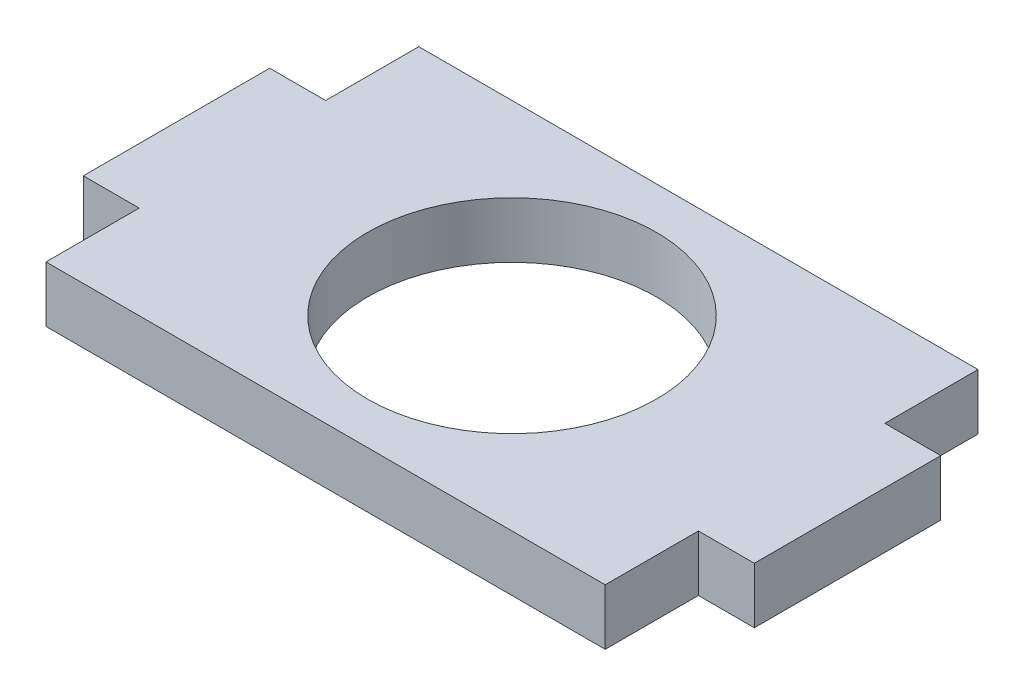
ISO-10303-21;
HEADER;
FILE_DESCRIPTION(('STEP AP214'),'2;1');
FILE_NAME('part.step','',(''),(''),'','','');
FILE_SCHEMA(('AUTOMOTIVE_DESIGN { 1 0 10303 214 1 1 1 1 }'));
ENDSEC;
DATA;
#1=APPLICATION_CONTEXT('core data for automotive mechanical design processes');
#2=APPLICATION_PROTOCOL_DEFINITION('international standard','automotive_design',2000,#1);
#3=PRODUCT_CONTEXT('',#1,'mechanical');
#4=PRODUCT('Part','Part','',(#3));
#5=PRODUCT_RELATED_PRODUCT_CATEGORY('part','',(#4));
#6=PRODUCT_DEFINITION_FORMATION('','',#4);
#7=PRODUCT_DEFINITION_CONTEXT('part definition',#1,'design');
#8=PRODUCT_DEFINITION('design','',#6,#7);
#9=PRODUCT_DEFINITION_SHAPE('','',#8);
#10=(LENGTH_UNIT() NAMED_UNIT(*) SI_UNIT(.MILLI.,.METRE.));
#11=(NAMED_UNIT(*) PLANE_ANGLE_UNIT() SI_UNIT($,.RADIAN.));
#12=(NAMED_UNIT(*) SI_UNIT($,.STERADIAN.) SOLID_ANGLE_UNIT());
#13=UNCERTAINTY_MEASURE_WITH_UNIT(LENGTH_MEASURE(1.E-05),#10,'distance_accuracy_value','');
#14=(GEOMETRIC_REPRESENTATION_CONTEXT(3) GLOBAL_UNCERTAINTY_ASSIGNED_CONTEXT((#13)) GLOBAL_UNIT_ASSIGNED_CONTEXT((#10,
#11,#12)) REPRESENTATION_CONTEXT('',''));
#15=CARTESIAN_POINT('',(0.,0.,0.));
#16=DIRECTION('',(0.,0.,1.));
#17=DIRECTION('',(1.,0.,0.));
#18=AXIS2_PLACEMENT_3D('',#15,#16,#17);
#19=CARTESIAN_POINT('',(0.,3.,0.));
#20=DIRECTION('',(0.,1.,0.));
#21=DIRECTION('',(0.,0.,1.));
#22=AXIS2_PLACEMENT_3D('',#19,#20,#21);
#23=PLANE('',#22);
#24=DIRECTION('',(-1.,0.,0.));
#25=VECTOR('',#24,1.);
#26=CARTESIAN_POINT('',(0.,3.,-5.));
#27=LINE('',#26,#25);
#28=CARTESIAN_POINT('',(3.,3.,-5.));
#29=VERTEX_POINT('',#28);
#30=CARTESIAN_POINT('',(0.,3.,-5.));
#31=VERTEX_POINT('',#30);
#32=EDGE_CURVE('E177',#29,#31,#27,.T.);
#33=ORIENTED_EDGE('',*,*,#32,.T.);
#34=DIRECTION('',(0.,0.,1.));
#35=VECTOR('',#34,1.);
#36=CARTESIAN_POINT('',(0.,3.,5.));
#37=LINE('',#36,#35);
#38=CARTESIAN_POINT('',(0.,3.,5.));
#39=VERTEX_POINT('',#38);
#40=EDGE_CURVE('E105',#31,#39,#37,.T.);
#41=ORIENTED_EDGE('',*,*,#40,.T.);
#42=DIRECTION('',(1.,0.,0.));
#43=VECTOR('',#42,1.);
#44=CARTESIAN_POINT('',(0.,3.,5.));
#45=LINE('',#44,#43);
#46=CARTESIAN_POINT('',(3.,3.,5.));
#47=VERTEX_POINT('',#46);
#48=EDGE_CURVE('E204',#39,#47,#45,.T.);
#49=ORIENTED_EDGE('',*,*,#48,.T.);
#50=DIRECTION('',(0.,0.,1.));
#51=VECTOR('',#50,1.);
#52=CARTESIAN_POINT('',(3.,3.,5.));
#53=LINE('',#52,#51);
#54=CARTESIAN_POINT('',(3.,3.,10.));
#55=VERTEX_POINT('',#54);
#56=EDGE_CURVE('E223',#47,#55,#53,.T.);
#57=ORIENTED_EDGE('',*,*,#56,.T.);
#58=DIRECTION('',(1.,0.,0.));
#59=VECTOR('',#58,1.);
#60=CARTESIAN_POINT('',(3.,3.,10.));
#61=LINE('',#60,#59);
#62=CARTESIAN_POINT('',(33.,3.,10.));
#63=VERTEX_POINT('',#62);
#64=EDGE_CURVE('E220',#55,#63,#61,.T.);
#65=ORIENTED_EDGE('',*,*,#64,.T.);
#66=DIRECTION('',(0.,0.,-1.));
#67=VECTOR('',#66,1.);
#68=CARTESIAN_POINT('',(33.,3.,5.));
#69=LINE('',#68,#67);
#70=CARTESIAN_POINT('',(33.,3.,5.));
#71=VERTEX_POINT('',#70);
#72=EDGE_CURVE('E222',#63,#71,#69,.T.);
#73=ORIENTED_EDGE('',*,*,#72,.T.);
#74=DIRECTION('',(1.,0.,0.));
#75=VECTOR('',#74,1.);
#76=CARTESIAN_POINT('',(36.,3.,5.));
#77=LINE('',#76,#75);
#78=CARTESIAN_POINT('',(36.,3.,5.));
#79=VERTEX_POINT('',#78);
#80=EDGE_CURVE('E225',#71,#79,#77,.T.);
#81=ORIENTED_EDGE('',*,*,#80,.T.);
#82=DIRECTION('',(0.,0.,-1.));
#83=VECTOR('',#82,1.);
#84=CARTESIAN_POINT('',(36.,3.,5.));
#85=LINE('',#84,#83);
#86=CARTESIAN_POINT('',(36.,3.,-5.));
#87=VERTEX_POINT('',#86);
#88=EDGE_CURVE('E231',#79,#87,#85,.T.);
#89=ORIENTED_EDGE('',*,*,#88,.T.);
#90=DIRECTION('',(-1.,0.,0.));
#91=VECTOR('',#90,1.);
#92=CARTESIAN_POINT('',(36.,3.,-5.));
#93=LINE('',#92,#91);
#94=CARTESIAN_POINT('',(33.,3.,-5.));
#95=VERTEX_POINT('',#94);
#96=EDGE_CURVE('E136',#87,#95,#93,.T.);
#97=ORIENTED_EDGE('',*,*,#96,.T.);
#98=DIRECTION('',(0.,0.,-1.));
#99=VECTOR('',#98,1.);
#100=CARTESIAN_POINT('',(33.,3.,-5.));
#101=LINE('',#100,#99);
#102=CARTESIAN_POINT('',(33.,3.,-10.));
#103=VERTEX_POINT('',#102);
#104=EDGE_CURVE('E130',#95,#103,#101,.T.);
#105=ORIENTED_EDGE('',*,*,#104,.T.);
#106=DIRECTION('',(-1.,0.,0.));
#107=VECTOR('',#106,1.);
#108=CARTESIAN_POINT('',(3.,3.,-10.));
#109=LINE('',#108,#107);
#110=CARTESIAN_POINT('',(3.,3.,-10.));
#111=VERTEX_POINT('',#110);
#112=EDGE_CURVE('E134',#103,#111,#109,.T.);
#113=ORIENTED_EDGE('',*,*,#112,.T.);
#114=DIRECTION('',(0.,0.,1.));
#115=VECTOR('',#114,1.);
#116=CARTESIAN_POINT('',(3.,3.,-5.));
#117=LINE('',#116,#115);
#118=EDGE_CURVE('E50',#111,#29,#117,.T.);
#119=ORIENTED_EDGE('',*,*,#118,.T.);
#120=EDGE_LOOP('',(#33,#41,#49,#57,#65,#73,#81,#89,#97,#105,#113,#119));
#121=FACE_BOUND('',#120,.T.);
#122=CARTESIAN_POINT('',(18.,3.,0.));
#123=DIRECTION('',(0.,1.,0.));
#124=DIRECTION('',(0.,0.,1.));
#125=AXIS2_PLACEMENT_3D('',#122,#123,#124);
#126=CIRCLE('',#125,7.75);
#127=CARTESIAN_POINT('',(18.,3.,7.75));
#128=VERTEX_POINT('',#127);
#129=EDGE_CURVE('E158',#128,#128,#126,.T.);
#130=ORIENTED_EDGE('',*,*,#129,.F.);
#131=EDGE_LOOP('',(#130));
#132=FACE_BOUND('',#131,.T.);
#133=ADVANCED_FACE('F33',(#121,#132),#23,.T.);
#134=CARTESIAN_POINT('',(0.,0.,0.));
#135=DIRECTION('',(0.,1.,0.));
#136=DIRECTION('',(0.,0.,1.));
#137=AXIS2_PLACEMENT_3D('',#134,#135,#136);
#138=PLANE('',#137);
#139=DIRECTION('',(-1.,0.,0.));
#140=VECTOR('',#139,1.);
#141=CARTESIAN_POINT('',(0.,0.,-5.));
#142=LINE('',#141,#140);
#143=CARTESIAN_POINT('',(3.,0.,-5.));
#144=VERTEX_POINT('',#143);
#145=CARTESIAN_POINT('',(0.,0.,-5.));
#146=VERTEX_POINT('',#145);
#147=EDGE_CURVE('E154',#144,#146,#142,.T.);
#148=ORIENTED_EDGE('',*,*,#147,.F.);
#149=DIRECTION('',(0.,0.,1.));
#150=VECTOR('',#149,1.);
#151=CARTESIAN_POINT('',(3.,0.,-5.));
#152=LINE('',#151,#150);
#153=CARTESIAN_POINT('',(3.,0.,-10.));
#154=VERTEX_POINT('',#153);
#155=EDGE_CURVE('E97',#154,#144,#152,.T.);
#156=ORIENTED_EDGE('',*,*,#155,.F.);
#157=DIRECTION('',(-1.,0.,0.));
#158=VECTOR('',#157,1.);
#159=CARTESIAN_POINT('',(3.,0.,-10.));
#160=LINE('',#159,#158);
#161=CARTESIAN_POINT('',(33.,0.,-10.));
#162=VERTEX_POINT('',#161);
#163=EDGE_CURVE('E91',#162,#154,#160,.T.);
#164=ORIENTED_EDGE('',*,*,#163,.F.);
#165=DIRECTION('',(0.,0.,-1.));
#166=VECTOR('',#165,1.);
#167=CARTESIAN_POINT('',(33.,0.,-5.));
#168=LINE('',#167,#166);
#169=CARTESIAN_POINT('',(33.,0.,-5.));
#170=VERTEX_POINT('',#169);
#171=EDGE_CURVE('E144',#170,#162,#168,.T.);
#172=ORIENTED_EDGE('',*,*,#171,.F.);
#173=DIRECTION('',(-1.,0.,0.));
#174=VECTOR('',#173,1.);
#175=CARTESIAN_POINT('',(36.,0.,-5.));
#176=LINE('',#175,#174);
#177=CARTESIAN_POINT('',(36.,0.,-5.));
#178=VERTEX_POINT('',#177);
#179=EDGE_CURVE('E172',#178,#170,#176,.T.);
#180=ORIENTED_EDGE('',*,*,#179,.F.);
#181=DIRECTION('',(0.,0.,-1.));
#182=VECTOR('',#181,1.);
#183=CARTESIAN_POINT('',(36.,0.,5.));
#184=LINE('',#183,#182);
#185=CARTESIAN_POINT('',(36.,0.,5.));
#186=VERTEX_POINT('',#185);
#187=EDGE_CURVE('E170',#186,#178,#184,.T.);
#188=ORIENTED_EDGE('',*,*,#187,.F.);
#189=DIRECTION('',(1.,0.,0.));
#190=VECTOR('',#189,1.);
#191=CARTESIAN_POINT('',(36.,0.,5.));
#192=LINE('',#191,#190);
#193=CARTESIAN_POINT('',(33.,0.,5.));
#194=VERTEX_POINT('',#193);
#195=EDGE_CURVE('E168',#194,#186,#192,.T.);
#196=ORIENTED_EDGE('',*,*,#195,.F.);
#197=DIRECTION('',(0.,0.,-1.));
#198=VECTOR('',#197,1.);
#199=CARTESIAN_POINT('',(33.,0.,5.));
#200=LINE('',#199,#198);
#201=CARTESIAN_POINT('',(33.,0.,10.));
#202=VERTEX_POINT('',#201);
#203=EDGE_CURVE('E166',#202,#194,#200,.T.);
#204=ORIENTED_EDGE('',*,*,#203,.F.);
#205=DIRECTION('',(1.,0.,0.));
#206=VECTOR('',#205,1.);
#207=CARTESIAN_POINT('',(3.,0.,10.));
#208=LINE('',#207,#206);
#209=CARTESIAN_POINT('',(3.,0.,10.));
#210=VERTEX_POINT('',#209);
#211=EDGE_CURVE('E164',#210,#202,#208,.T.);
#212=ORIENTED_EDGE('',*,*,#211,.F.);
#213=DIRECTION('',(0.,0.,1.));
#214=VECTOR('',#213,1.);
#215=CARTESIAN_POINT('',(3.,0.,5.));
#216=LINE('',#215,#214);
#217=CARTESIAN_POINT('',(3.,0.,5.));
#218=VERTEX_POINT('',#217);
#219=EDGE_CURVE('E162',#218,#210,#216,.T.);
#220=ORIENTED_EDGE('',*,*,#219,.F.);
#221=DIRECTION('',(1.,0.,0.));
#222=VECTOR('',#221,1.);
#223=CARTESIAN_POINT('',(0.,0.,5.));
#224=LINE('',#223,#222);
#225=CARTESIAN_POINT('',(0.,0.,5.));
#226=VERTEX_POINT('',#225);
#227=EDGE_CURVE('E160',#226,#218,#224,.T.);
#228=ORIENTED_EDGE('',*,*,#227,.F.);
#229=DIRECTION('',(0.,0.,1.));
#230=VECTOR('',#229,1.);
#231=CARTESIAN_POINT('',(0.,0.,5.));
#232=LINE('',#231,#230);
#233=EDGE_CURVE('E157',#146,#226,#232,.T.);
#234=ORIENTED_EDGE('',*,*,#233,.F.);
#235=EDGE_LOOP('',(#148,#156,#164,#172,#180,#188,#196,#204,#212,#220,#228,#234));
#236=FACE_BOUND('',#235,.T.);
#237=CARTESIAN_POINT('',(18.,0.,0.));
#238=DIRECTION('',(0.,1.,0.));
#239=DIRECTION('',(0.,0.,1.));
#240=AXIS2_PLACEMENT_3D('',#237,#238,#239);
#241=CIRCLE('',#240,7.75);
#242=CARTESIAN_POINT('',(18.,0.,7.75));
#243=VERTEX_POINT('',#242);
#244=EDGE_CURVE('E378',#243,#243,#241,.T.);
#245=ORIENTED_EDGE('',*,*,#244,.T.);
#246=EDGE_LOOP('',(#245));
#247=FACE_BOUND('',#246,.T.);
#248=ADVANCED_FACE('F208',(#236,#247),#138,.F.);
#249=CARTESIAN_POINT('',(0.,3.,-5.));
#250=DIRECTION('',(0.,0.,1.));
#251=DIRECTION('',(1.,0.,0.));
#252=AXIS2_PLACEMENT_3D('',#249,#250,#251);
#253=PLANE('',#252);
#254=ORIENTED_EDGE('',*,*,#147,.T.);
#255=DIRECTION('',(0.,-1.,0.));
#256=VECTOR('',#255,1.);
#257=CARTESIAN_POINT('',(0.,3.,-5.));
#258=LINE('',#257,#256);
#259=EDGE_CURVE('E11',#31,#146,#258,.T.);
#260=ORIENTED_EDGE('',*,*,#259,.F.);
#261=ORIENTED_EDGE('',*,*,#32,.F.);
#262=DIRECTION('',(0.,-1.,0.));
#263=VECTOR('',#262,1.);
#264=CARTESIAN_POINT('',(3.,3.,-5.));
#265=LINE('',#264,#263);
#266=EDGE_CURVE('E150',#29,#144,#265,.T.);
#267=ORIENTED_EDGE('',*,*,#266,.T.);
#268=EDGE_LOOP('',(#254,#260,#261,#267));
#269=FACE_BOUND('',#268,.T.);
#270=ADVANCED_FACE('F35',(#269),#253,.F.);
#271=CARTESIAN_POINT('',(0.,3.,5.));
#272=DIRECTION('',(1.,0.,0.));
#273=DIRECTION('',(0.,0.,-1.));
#274=AXIS2_PLACEMENT_3D('',#271,#272,#273);
#275=PLANE('',#274);
#276=ORIENTED_EDGE('',*,*,#233,.T.);
#277=DIRECTION('',(0.,-1.,0.));
#278=VECTOR('',#277,1.);
#279=CARTESIAN_POINT('',(0.,3.,5.));
#280=LINE('',#279,#278);
#281=EDGE_CURVE('E42',#39,#226,#280,.T.);
#282=ORIENTED_EDGE('',*,*,#281,.F.);
#283=ORIENTED_EDGE('',*,*,#40,.F.);
#284=ORIENTED_EDGE('',*,*,#259,.T.);
#285=EDGE_LOOP('',(#276,#282,#283,#284));
#286=FACE_BOUND('',#285,.T.);
#287=ADVANCED_FACE('F265',(#286),#275,.F.);
#288=CARTESIAN_POINT('',(0.,3.,5.));
#289=DIRECTION('',(0.,0.,-1.));
#290=DIRECTION('',(-1.,0.,0.));
#291=AXIS2_PLACEMENT_3D('',#288,#289,#290);
#292=PLANE('',#291);
#293=ORIENTED_EDGE('',*,*,#227,.T.);
#294=DIRECTION('',(0.,-1.,0.));
#295=VECTOR('',#294,1.);
#296=CARTESIAN_POINT('',(3.,3.,5.));
#297=LINE('',#296,#295);
#298=EDGE_CURVE('E196',#47,#218,#297,.T.);
#299=ORIENTED_EDGE('',*,*,#298,.F.);
#300=ORIENTED_EDGE('',*,*,#48,.F.);
#301=ORIENTED_EDGE('',*,*,#281,.T.);
#302=EDGE_LOOP('',(#293,#299,#300,#301));
#303=FACE_BOUND('',#302,.T.);
#304=ADVANCED_FACE('F202',(#303),#292,.F.);
#305=CARTESIAN_POINT('',(3.,3.,5.));
#306=DIRECTION('',(1.,0.,0.));
#307=DIRECTION('',(0.,0.,-1.));
#308=AXIS2_PLACEMENT_3D('',#305,#306,#307);
#309=PLANE('',#308);
#310=ORIENTED_EDGE('',*,*,#219,.T.);
#311=DIRECTION('',(0.,-1.,0.));
#312=VECTOR('',#311,1.);
#313=CARTESIAN_POINT('',(3.,3.,10.));
#314=LINE('',#313,#312);
#315=EDGE_CURVE('E193',#55,#210,#314,.T.);
#316=ORIENTED_EDGE('',*,*,#315,.F.);
#317=ORIENTED_EDGE('',*,*,#56,.F.);
#318=ORIENTED_EDGE('',*,*,#298,.T.);
#319=EDGE_LOOP('',(#310,#316,#317,#318));
#320=FACE_BOUND('',#319,.T.);
#321=ADVANCED_FACE('F214',(#320),#309,.F.);
#322=CARTESIAN_POINT('',(3.,3.,10.));
#323=DIRECTION('',(0.,0.,-1.));
#324=DIRECTION('',(-1.,0.,0.));
#325=AXIS2_PLACEMENT_3D('',#322,#323,#324);
#326=PLANE('',#325);
#327=ORIENTED_EDGE('',*,*,#211,.T.);
#328=DIRECTION('',(0.,-1.,0.));
#329=VECTOR('',#328,1.);
#330=CARTESIAN_POINT('',(33.,3.,10.));
#331=LINE('',#330,#329);
#332=EDGE_CURVE('E190',#63,#202,#331,.T.);
#333=ORIENTED_EDGE('',*,*,#332,.F.);
#334=ORIENTED_EDGE('',*,*,#64,.F.);
#335=ORIENTED_EDGE('',*,*,#315,.T.);
#336=EDGE_LOOP('',(#327,#333,#334,#335));
#337=FACE_BOUND('',#336,.T.);
#338=ADVANCED_FACE('F218',(#337),#326,.F.);
#339=CARTESIAN_POINT('',(33.,3.,5.));
#340=DIRECTION('',(-1.,0.,0.));
#341=DIRECTION('',(0.,0.,1.));
#342=AXIS2_PLACEMENT_3D('',#339,#340,#341);
#343=PLANE('',#342);
#344=ORIENTED_EDGE('',*,*,#203,.T.);
#345=DIRECTION('',(0.,-1.,0.));
#346=VECTOR('',#345,1.);
#347=CARTESIAN_POINT('',(33.,3.,5.));
#348=LINE('',#347,#346);
#349=EDGE_CURVE('E187',#71,#194,#348,.T.);
#350=ORIENTED_EDGE('',*,*,#349,.F.);
#351=ORIENTED_EDGE('',*,*,#72,.F.);
#352=ORIENTED_EDGE('',*,*,#332,.T.);
#353=EDGE_LOOP('',(#344,#350,#351,#352));
#354=FACE_BOUND('',#353,.T.);
#355=ADVANCED_FACE('F278',(#354),#343,.F.);
#356=CARTESIAN_POINT('',(36.,3.,5.));
#357=DIRECTION('',(0.,0.,-1.));
#358=DIRECTION('',(-1.,0.,0.));
#359=AXIS2_PLACEMENT_3D('',#356,#357,#358);
#360=PLANE('',#359);
#361=ORIENTED_EDGE('',*,*,#195,.T.);
#362=DIRECTION('',(0.,-1.,0.));
#363=VECTOR('',#362,1.);
#364=CARTESIAN_POINT('',(36.,3.,5.));
#365=LINE('',#364,#363);
#366=EDGE_CURVE('E184',#79,#186,#365,.T.);
#367=ORIENTED_EDGE('',*,*,#366,.F.);
#368=ORIENTED_EDGE('',*,*,#80,.F.);
#369=ORIENTED_EDGE('',*,*,#349,.T.);
#370=EDGE_LOOP('',(#361,#367,#368,#369));
#371=FACE_BOUND('',#370,.T.);
#372=ADVANCED_FACE('F281',(#371),#360,.F.);
#373=CARTESIAN_POINT('',(36.,3.,5.));
#374=DIRECTION('',(-1.,0.,0.));
#375=DIRECTION('',(0.,0.,1.));
#376=AXIS2_PLACEMENT_3D('',#373,#374,#375);
#377=PLANE('',#376);
#378=ORIENTED_EDGE('',*,*,#187,.T.);
#379=DIRECTION('',(0.,-1.,0.));
#380=VECTOR('',#379,1.);
#381=CARTESIAN_POINT('',(36.,3.,-5.));
#382=LINE('',#381,#380);
#383=EDGE_CURVE('E181',#87,#178,#382,.T.);
#384=ORIENTED_EDGE('',*,*,#383,.F.);
#385=ORIENTED_EDGE('',*,*,#88,.F.);
#386=ORIENTED_EDGE('',*,*,#366,.T.);
#387=EDGE_LOOP('',(#378,#384,#385,#386));
#388=FACE_BOUND('',#387,.T.);
#389=ADVANCED_FACE('F237',(#388),#377,.F.);
#390=CARTESIAN_POINT('',(36.,3.,-5.));
#391=DIRECTION('',(0.,0.,1.));
#392=DIRECTION('',(1.,0.,0.));
#393=AXIS2_PLACEMENT_3D('',#390,#391,#392);
#394=PLANE('',#393);
#395=ORIENTED_EDGE('',*,*,#179,.T.);
#396=DIRECTION('',(0.,-1.,0.));
#397=VECTOR('',#396,1.);
#398=CARTESIAN_POINT('',(33.,3.,-5.));
#399=LINE('',#398,#397);
#400=EDGE_CURVE('E145',#95,#170,#399,.T.);
#401=ORIENTED_EDGE('',*,*,#400,.F.);
#402=ORIENTED_EDGE('',*,*,#96,.F.);
#403=ORIENTED_EDGE('',*,*,#383,.T.);
#404=EDGE_LOOP('',(#395,#401,#402,#403));
#405=FACE_BOUND('',#404,.T.);
#406=ADVANCED_FACE('F241',(#405),#394,.F.);
#407=CARTESIAN_POINT('',(33.,3.,-5.));
#408=DIRECTION('',(-1.,0.,0.));
#409=DIRECTION('',(0.,0.,1.));
#410=AXIS2_PLACEMENT_3D('',#407,#408,#409);
#411=PLANE('',#410);
#412=ORIENTED_EDGE('',*,*,#171,.T.);
#413=DIRECTION('',(0.,-1.,0.));
#414=VECTOR('',#413,1.);
#415=CARTESIAN_POINT('',(33.,3.,-10.));
#416=LINE('',#415,#414);
#417=EDGE_CURVE('E141',#103,#162,#416,.T.);
#418=ORIENTED_EDGE('',*,*,#417,.F.);
#419=ORIENTED_EDGE('',*,*,#104,.F.);
#420=ORIENTED_EDGE('',*,*,#400,.T.);
#421=EDGE_LOOP('',(#412,#418,#419,#420));
#422=FACE_BOUND('',#421,.T.);
#423=ADVANCED_FACE('F142',(#422),#411,.F.);
#424=CARTESIAN_POINT('',(3.,3.,-10.));
#425=DIRECTION('',(0.,0.,1.));
#426=DIRECTION('',(1.,0.,0.));
#427=AXIS2_PLACEMENT_3D('',#424,#425,#426);
#428=PLANE('',#427);
#429=ORIENTED_EDGE('',*,*,#163,.T.);
#430=DIRECTION('',(0.,-1.,0.));
#431=VECTOR('',#430,1.);
#432=CARTESIAN_POINT('',(3.,3.,-10.));
#433=LINE('',#432,#431);
#434=EDGE_CURVE('E146',#111,#154,#433,.T.);
#435=ORIENTED_EDGE('',*,*,#434,.F.);
#436=ORIENTED_EDGE('',*,*,#112,.F.);
#437=ORIENTED_EDGE('',*,*,#417,.T.);
#438=EDGE_LOOP('',(#429,#435,#436,#437));
#439=FACE_BOUND('',#438,.T.);
#440=ADVANCED_FACE('F148',(#439),#428,.F.);
#441=CARTESIAN_POINT('',(3.,3.,-5.));
#442=DIRECTION('',(1.,0.,0.));
#443=DIRECTION('',(0.,0.,-1.));
#444=AXIS2_PLACEMENT_3D('',#441,#442,#443);
#445=PLANE('',#444);
#446=ORIENTED_EDGE('',*,*,#155,.T.);
#447=ORIENTED_EDGE('',*,*,#266,.F.);
#448=ORIENTED_EDGE('',*,*,#118,.F.);
#449=ORIENTED_EDGE('',*,*,#434,.T.);
#450=EDGE_LOOP('',(#446,#447,#448,#449));
#451=FACE_BOUND('',#450,.T.);
#452=ADVANCED_FACE('F245',(#451),#445,.F.);
#453=CARTESIAN_POINT('',(18.,3.,0.));
#454=DIRECTION('',(0.,-1.,0.));
#455=DIRECTION('',(0.,0.,-1.));
#456=AXIS2_PLACEMENT_3D('',#453,#454,#455);
#457=CYLINDRICAL_SURFACE('',#456,7.75);
#458=ORIENTED_EDGE('',*,*,#129,.T.);
#459=EDGE_LOOP('',(#458));
#460=FACE_BOUND('',#459,.T.);
#461=ORIENTED_EDGE('',*,*,#244,.F.);
#462=EDGE_LOOP('',(#461));
#463=FACE_BOUND('',#462,.T.);
#464=ADVANCED_FACE('F247',(#460,#463),#457,.F.);
#465=CLOSED_SHELL('',(#133,#248,#270,#287,#304,#321,#338,#355,#372,#389,#406,#423,#440,#452,#464));
#466=MANIFOLD_SOLID_BREP('B2',#465);
#467=ADVANCED_BREP_SHAPE_REPRESENTATION('',(#18,#466),#14);
#468=SHAPE_DEFINITION_REPRESENTATION(#9,#467);
ENDSEC;
END-ISO-10303-21;
